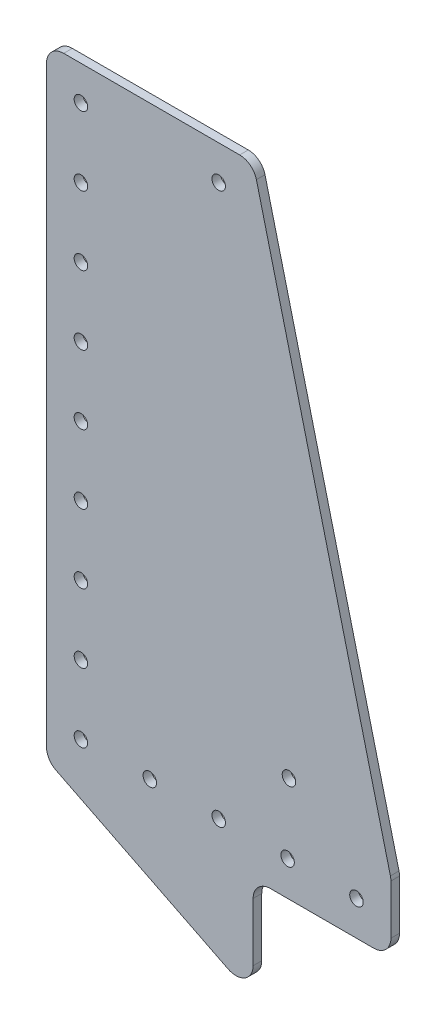
ISO-10303-21;
HEADER;
FILE_DESCRIPTION(('STEP AP214'),'2;1');
FILE_NAME('part.step','',(''),(''),'','','');
FILE_SCHEMA(('AUTOMOTIVE_DESIGN { 1 0 10303 214 1 1 1 1 }'));
ENDSEC;
DATA;
#1=APPLICATION_CONTEXT('core data for automotive mechanical design processes');
#2=APPLICATION_PROTOCOL_DEFINITION('international standard','automotive_design',2000,#1);
#3=PRODUCT_CONTEXT('',#1,'mechanical');
#4=PRODUCT('Part','Part','',(#3));
#5=PRODUCT_RELATED_PRODUCT_CATEGORY('part','',(#4));
#6=PRODUCT_DEFINITION_FORMATION('','',#4);
#7=PRODUCT_DEFINITION_CONTEXT('part definition',#1,'design');
#8=PRODUCT_DEFINITION('design','',#6,#7);
#9=PRODUCT_DEFINITION_SHAPE('','',#8);
#10=(LENGTH_UNIT() NAMED_UNIT(*) SI_UNIT(.MILLI.,.METRE.));
#11=(NAMED_UNIT(*) PLANE_ANGLE_UNIT() SI_UNIT($,.RADIAN.));
#12=(NAMED_UNIT(*) SI_UNIT($,.STERADIAN.) SOLID_ANGLE_UNIT());
#13=UNCERTAINTY_MEASURE_WITH_UNIT(LENGTH_MEASURE(1.E-05),#10,'distance_accuracy_value','');
#14=(GEOMETRIC_REPRESENTATION_CONTEXT(3) GLOBAL_UNCERTAINTY_ASSIGNED_CONTEXT((#13)) GLOBAL_UNIT_ASSIGNED_CONTEXT((#10,
#11,#12)) REPRESENTATION_CONTEXT('',''));
#15=CARTESIAN_POINT('',(0.,0.,0.));
#16=DIRECTION('',(0.,0.,1.));
#17=DIRECTION('',(1.,0.,0.));
#18=AXIS2_PLACEMENT_3D('',#15,#16,#17);
#19=CARTESIAN_POINT('',(133.35,449.423468227803,3.175));
#20=DIRECTION('',(-1.,0.,0.));
#21=DIRECTION('',(0.,0.,1.));
#22=AXIS2_PLACEMENT_3D('',#19,#20,#21);
#23=PLANE('',#22);
#24=DIRECTION('',(0.,1.,0.));
#25=VECTOR('',#24,1.);
#26=CARTESIAN_POINT('',(133.35,449.423468227803,3.175));
#27=LINE('',#26,#25);
#28=CARTESIAN_POINT('',(133.35,455.773468227803,3.175));
#29=VERTEX_POINT('',#28);
#30=CARTESIAN_POINT('',(133.35,474.041747505131,3.175));
#31=VERTEX_POINT('',#30);
#32=EDGE_CURVE('E162',#29,#31,#27,.T.);
#33=ORIENTED_EDGE('',*,*,#32,.F.);
#34=DIRECTION('',(0.,0.,-1.));
#35=VECTOR('',#34,1.);
#36=CARTESIAN_POINT('',(133.35,455.773468227803,3.175));
#37=LINE('',#36,#35);
#38=CARTESIAN_POINT('',(133.35,455.773468227803,0.));
#39=VERTEX_POINT('',#38);
#40=EDGE_CURVE('E147',#29,#39,#37,.T.);
#41=ORIENTED_EDGE('',*,*,#40,.T.);
#42=DIRECTION('',(0.,1.,0.));
#43=VECTOR('',#42,1.);
#44=CARTESIAN_POINT('',(133.35,449.423468227803,0.));
#45=LINE('',#44,#43);
#46=CARTESIAN_POINT('',(133.35,474.041747505131,0.));
#47=VERTEX_POINT('',#46);
#48=EDGE_CURVE('E159',#39,#47,#45,.T.);
#49=ORIENTED_EDGE('',*,*,#48,.T.);
#50=DIRECTION('',(0.,0.,-1.));
#51=VECTOR('',#50,1.);
#52=CARTESIAN_POINT('',(133.35,474.041747505131,3.175));
#53=LINE('',#52,#51);
#54=EDGE_CURVE('E164',#47,#31,#53,.F.);
#55=ORIENTED_EDGE('',*,*,#54,.T.);
#56=EDGE_LOOP('',(#33,#41,#49,#55));
#57=FACE_BOUND('',#56,.T.);
#58=ADVANCED_FACE('F41',(#57),#23,.F.);
#59=CARTESIAN_POINT('',(133.35,474.823468227803,3.175));
#60=DIRECTION('',(-0.970142500145332,-0.242535625036333,0.));
#61=DIRECTION('',(0.242535625036333,-0.970142500145332,0.));
#62=AXIS2_PLACEMENT_3D('',#59,#60,#61);
#63=PLANE('',#62);
#64=DIRECTION('',(-0.242535625036333,0.970142500145332,0.));
#65=VECTOR('',#64,1.);
#66=CARTESIAN_POINT('',(133.35,474.823468227803,0.));
#67=LINE('',#66,#65);
#68=CARTESIAN_POINT('',(133.160404875923,475.581848724112,0.));
#69=VERTEX_POINT('',#68);
#70=CARTESIAN_POINT('',(83.7524746952547,673.213569446784,0.));
#71=VERTEX_POINT('',#70);
#72=EDGE_CURVE('E169',#69,#71,#67,.T.);
#73=ORIENTED_EDGE('',*,*,#72,.T.);
#74=DIRECTION('',(0.,0.,-1.));
#75=VECTOR('',#74,1.);
#76=CARTESIAN_POINT('',(83.7524746952547,673.213569446784,3.175));
#77=LINE('',#76,#75);
#78=CARTESIAN_POINT('',(83.7524746952547,673.213569446784,3.175));
#79=VERTEX_POINT('',#78);
#80=EDGE_CURVE('E238',#71,#79,#77,.F.);
#81=ORIENTED_EDGE('',*,*,#80,.T.);
#82=DIRECTION('',(-0.242535625036333,0.970142500145332,0.));
#83=VECTOR('',#82,1.);
#84=CARTESIAN_POINT('',(133.35,474.823468227803,3.175));
#85=LINE('',#84,#83);
#86=CARTESIAN_POINT('',(133.160404875923,475.581848724112,3.175));
#87=VERTEX_POINT('',#86);
#88=EDGE_CURVE('E261',#87,#79,#85,.T.);
#89=ORIENTED_EDGE('',*,*,#88,.F.);
#90=DIRECTION('',(0.,0.,-1.));
#91=VECTOR('',#90,1.);
#92=CARTESIAN_POINT('',(133.160404875923,475.581848724112,3.175));
#93=LINE('',#92,#91);
#94=EDGE_CURVE('E235',#87,#69,#93,.T.);
#95=ORIENTED_EDGE('',*,*,#94,.T.);
#96=EDGE_LOOP('',(#73,#81,#89,#95));
#97=FACE_BOUND('',#96,.T.);
#98=ADVANCED_FACE('F383',(#97),#63,.F.);
#99=CARTESIAN_POINT('',(6.34999999999988,678.023468227803,3.175));
#100=DIRECTION('',(0.,-1.,0.));
#101=DIRECTION('',(1.,0.,0.));
#102=AXIS2_PLACEMENT_3D('',#99,#100,#101);
#103=PLANE('',#102);
#104=DIRECTION('',(-1.,0.,0.));
#105=VECTOR('',#104,1.);
#106=CARTESIAN_POINT('',(6.34999999999988,678.023468227803,3.175));
#107=LINE('',#106,#105);
#108=CARTESIAN_POINT('',(77.5920698193318,678.023468227803,3.175));
#109=VERTEX_POINT('',#108);
#110=CARTESIAN_POINT('',(12.6999999999999,678.023468227803,3.175));
#111=VERTEX_POINT('',#110);
#112=EDGE_CURVE('E258',#109,#111,#107,.T.);
#113=ORIENTED_EDGE('',*,*,#112,.F.);
#114=DIRECTION('',(0.,0.,-1.));
#115=VECTOR('',#114,1.);
#116=CARTESIAN_POINT('',(77.5920698193318,678.023468227803,3.175));
#117=LINE('',#116,#115);
#118=CARTESIAN_POINT('',(77.5920698193318,678.023468227803,0.));
#119=VERTEX_POINT('',#118);
#120=EDGE_CURVE('E232',#109,#119,#117,.T.);
#121=ORIENTED_EDGE('',*,*,#120,.T.);
#122=DIRECTION('',(-1.,0.,0.));
#123=VECTOR('',#122,1.);
#124=CARTESIAN_POINT('',(6.34999999999988,678.023468227803,0.));
#125=LINE('',#124,#123);
#126=CARTESIAN_POINT('',(12.6999999999999,678.023468227803,0.));
#127=VERTEX_POINT('',#126);
#128=EDGE_CURVE('E173',#119,#127,#125,.T.);
#129=ORIENTED_EDGE('',*,*,#128,.T.);
#130=DIRECTION('',(0.,0.,-1.));
#131=VECTOR('',#130,1.);
#132=CARTESIAN_POINT('',(12.6999999999999,678.023468227803,3.175));
#133=LINE('',#132,#131);
#134=EDGE_CURVE('E230',#127,#111,#133,.F.);
#135=ORIENTED_EDGE('',*,*,#134,.T.);
#136=EDGE_LOOP('',(#113,#121,#129,#135));
#137=FACE_BOUND('',#136,.T.);
#138=ADVANCED_FACE('F389',(#137),#103,.F.);
#139=CARTESIAN_POINT('',(6.34999999999988,678.023468227803,3.175));
#140=DIRECTION('',(1.,0.,0.));
#141=DIRECTION('',(0.,1.,0.));
#142=AXIS2_PLACEMENT_3D('',#139,#140,#141);
#143=PLANE('',#142);
#144=DIRECTION('',(0.,-1.,0.));
#145=VECTOR('',#144,1.);
#146=CARTESIAN_POINT('',(6.34999999999988,678.023468227803,0.));
#147=LINE('',#146,#145);
#148=CARTESIAN_POINT('',(6.34999999999988,671.673468227803,0.));
#149=VERTEX_POINT('',#148);
#150=CARTESIAN_POINT('',(6.34999999999991,453.347984056365,0.));
#151=VERTEX_POINT('',#150);
#152=EDGE_CURVE('E184',#149,#151,#147,.T.);
#153=ORIENTED_EDGE('',*,*,#152,.T.);
#154=DIRECTION('',(0.,0.,-1.));
#155=VECTOR('',#154,1.);
#156=CARTESIAN_POINT('',(6.34999999999991,453.347984056365,3.175));
#157=LINE('',#156,#155);
#158=CARTESIAN_POINT('',(6.34999999999991,453.347984056365,3.175));
#159=VERTEX_POINT('',#158);
#160=EDGE_CURVE('E228',#151,#159,#157,.F.);
#161=ORIENTED_EDGE('',*,*,#160,.T.);
#162=DIRECTION('',(0.,-1.,0.));
#163=VECTOR('',#162,1.);
#164=CARTESIAN_POINT('',(6.34999999999988,678.023468227803,3.175));
#165=LINE('',#164,#163);
#166=CARTESIAN_POINT('',(6.34999999999988,671.673468227803,3.175));
#167=VERTEX_POINT('',#166);
#168=EDGE_CURVE('E253',#167,#159,#165,.T.);
#169=ORIENTED_EDGE('',*,*,#168,.F.);
#170=DIRECTION('',(0.,0.,-1.));
#171=VECTOR('',#170,1.);
#172=CARTESIAN_POINT('',(6.34999999999988,671.673468227803,3.175));
#173=LINE('',#172,#171);
#174=EDGE_CURVE('E225',#167,#149,#173,.T.);
#175=ORIENTED_EDGE('',*,*,#174,.T.);
#176=EDGE_LOOP('',(#153,#161,#169,#175));
#177=FACE_BOUND('',#176,.T.);
#178=ADVANCED_FACE('F432',(#177),#143,.F.);
#179=CARTESIAN_POINT('',(6.34999999999991,449.423468227803,3.175));
#180=DIRECTION('',(0.447213595499958,0.894427190999916,0.));
#181=DIRECTION('',(-0.894427190999916,0.447213595499958,0.));
#182=AXIS2_PLACEMENT_3D('',#179,#180,#181);
#183=PLANE('',#182);
#184=DIRECTION('',(0.894427190999916,-0.447213595499958,0.));
#185=VECTOR('',#184,1.);
#186=CARTESIAN_POINT('',(6.34999999999991,449.423468227803,0.));
#187=LINE('',#186,#185);
#188=CARTESIAN_POINT('',(9.8601936685752,447.668371393515,0.));
#189=VERTEX_POINT('',#188);
#190=CARTESIAN_POINT('',(73.3601936685752,415.918371393515,0.));
#191=VERTEX_POINT('',#190);
#192=EDGE_CURVE('E187',#189,#191,#187,.T.);
#193=ORIENTED_EDGE('',*,*,#192,.T.);
#194=DIRECTION('',(0.,0.,-1.));
#195=VECTOR('',#194,1.);
#196=CARTESIAN_POINT('',(73.3601936685752,415.918371393515,3.175));
#197=LINE('',#196,#195);
#198=CARTESIAN_POINT('',(73.3601936685752,415.918371393515,3.175));
#199=VERTEX_POINT('',#198);
#200=EDGE_CURVE('E223',#191,#199,#197,.F.);
#201=ORIENTED_EDGE('',*,*,#200,.T.);
#202=DIRECTION('',(0.894427190999916,-0.447213595499958,0.));
#203=VECTOR('',#202,1.);
#204=CARTESIAN_POINT('',(6.34999999999991,449.423468227803,3.175));
#205=LINE('',#204,#203);
#206=CARTESIAN_POINT('',(9.8601936685752,447.668371393515,3.175));
#207=VERTEX_POINT('',#206);
#208=EDGE_CURVE('E252',#207,#199,#205,.T.);
#209=ORIENTED_EDGE('',*,*,#208,.F.);
#210=DIRECTION('',(0.,0.,-1.));
#211=VECTOR('',#210,1.);
#212=CARTESIAN_POINT('',(9.8601936685752,447.668371393515,3.175));
#213=LINE('',#212,#211);
#214=EDGE_CURVE('E220',#207,#189,#213,.T.);
#215=ORIENTED_EDGE('',*,*,#214,.T.);
#216=EDGE_LOOP('',(#193,#201,#209,#215));
#217=FACE_BOUND('',#216,.T.);
#218=ADVANCED_FACE('F438',(#217),#183,.F.);
#219=CARTESIAN_POINT('',(82.5499999999999,411.323468227803,3.175));
#220=DIRECTION('',(-1.,0.,0.));
#221=DIRECTION('',(0.,0.,1.));
#222=AXIS2_PLACEMENT_3D('',#219,#220,#221);
#223=PLANE('',#222);
#224=DIRECTION('',(0.,1.,0.));
#225=VECTOR('',#224,1.);
#226=CARTESIAN_POINT('',(82.5499999999999,411.323468227803,0.));
#227=LINE('',#226,#225);
#228=CARTESIAN_POINT('',(82.5499999999999,421.597984056365,0.));
#229=VERTEX_POINT('',#228);
#230=CARTESIAN_POINT('',(82.5499999999999,443.073468227803,0.));
#231=VERTEX_POINT('',#230);
#232=EDGE_CURVE('E190',#229,#231,#227,.T.);
#233=ORIENTED_EDGE('',*,*,#232,.T.);
#234=DIRECTION('',(0.,0.,-1.));
#235=VECTOR('',#234,1.);
#236=CARTESIAN_POINT('',(82.5499999999999,443.073468227803,3.175));
#237=LINE('',#236,#235);
#238=CARTESIAN_POINT('',(82.5499999999999,443.073468227803,3.175));
#239=VERTEX_POINT('',#238);
#240=EDGE_CURVE('E56',#231,#239,#237,.F.);
#241=ORIENTED_EDGE('',*,*,#240,.T.);
#242=DIRECTION('',(0.,1.,0.));
#243=VECTOR('',#242,1.);
#244=CARTESIAN_POINT('',(82.5499999999999,411.323468227803,3.175));
#245=LINE('',#244,#243);
#246=CARTESIAN_POINT('',(82.5499999999999,421.597984056365,3.175));
#247=VERTEX_POINT('',#246);
#248=EDGE_CURVE('E249',#247,#239,#245,.T.);
#249=ORIENTED_EDGE('',*,*,#248,.F.);
#250=DIRECTION('',(0.,0.,-1.));
#251=VECTOR('',#250,1.);
#252=CARTESIAN_POINT('',(82.5499999999999,421.597984056365,3.175));
#253=LINE('',#252,#251);
#254=EDGE_CURVE('E216',#247,#229,#253,.T.);
#255=ORIENTED_EDGE('',*,*,#254,.T.);
#256=EDGE_LOOP('',(#233,#241,#249,#255));
#257=FACE_BOUND('',#256,.T.);
#258=ADVANCED_FACE('F242',(#257),#223,.F.);
#259=CARTESIAN_POINT('',(133.35,449.423468227803,3.175));
#260=DIRECTION('',(0.,1.,0.));
#261=DIRECTION('',(0.,0.,1.));
#262=AXIS2_PLACEMENT_3D('',#259,#260,#261);
#263=PLANE('',#262);
#264=DIRECTION('',(1.,0.,0.));
#265=VECTOR('',#264,1.);
#266=CARTESIAN_POINT('',(133.35,449.423468227803,0.));
#267=LINE('',#266,#265);
#268=CARTESIAN_POINT('',(88.8999999999999,449.423468227803,0.));
#269=VERTEX_POINT('',#268);
#270=CARTESIAN_POINT('',(127.,449.423468227803,0.));
#271=VERTEX_POINT('',#270);
#272=EDGE_CURVE('E192',#269,#271,#267,.T.);
#273=ORIENTED_EDGE('',*,*,#272,.T.);
#274=DIRECTION('',(0.,0.,-1.));
#275=VECTOR('',#274,1.);
#276=CARTESIAN_POINT('',(127.,449.423468227803,3.175));
#277=LINE('',#276,#275);
#278=CARTESIAN_POINT('',(127.,449.423468227803,3.175));
#279=VERTEX_POINT('',#278);
#280=EDGE_CURVE('E148',#271,#279,#277,.F.);
#281=ORIENTED_EDGE('',*,*,#280,.T.);
#282=DIRECTION('',(1.,0.,0.));
#283=VECTOR('',#282,1.);
#284=CARTESIAN_POINT('',(133.35,449.423468227803,3.175));
#285=LINE('',#284,#283);
#286=CARTESIAN_POINT('',(88.8999999999999,449.423468227803,3.175));
#287=VERTEX_POINT('',#286);
#288=EDGE_CURVE('E179',#287,#279,#285,.T.);
#289=ORIENTED_EDGE('',*,*,#288,.F.);
#290=DIRECTION('',(0.,0.,-1.));
#291=VECTOR('',#290,1.);
#292=CARTESIAN_POINT('',(88.8999999999999,449.423468227803,0.));
#293=LINE('',#292,#291);
#294=EDGE_CURVE('E153',#287,#269,#293,.T.);
#295=ORIENTED_EDGE('',*,*,#294,.T.);
#296=EDGE_LOOP('',(#273,#281,#289,#295));
#297=FACE_BOUND('',#296,.T.);
#298=ADVANCED_FACE('F251',(#297),#263,.F.);
#299=CARTESIAN_POINT('',(0.,0.,3.175));
#300=DIRECTION('',(0.,0.,-1.));
#301=DIRECTION('',(-1.,0.,0.));
#302=AXIS2_PLACEMENT_3D('',#299,#300,#301);
#303=PLANE('',#302);
#304=CARTESIAN_POINT('',(69.8500000000001,665.323468227803,3.175));
#305=DIRECTION('',(0.,0.,1.));
#306=DIRECTION('',(1.,0.,0.));
#307=AXIS2_PLACEMENT_3D('',#304,#305,#306);
#308=CIRCLE('',#307,2.48919999999991);
#309=CARTESIAN_POINT('',(72.3392,665.323468227803,3.175));
#310=VERTEX_POINT('',#309);
#311=EDGE_CURVE('E271',#310,#310,#308,.T.);
#312=ORIENTED_EDGE('',*,*,#311,.F.);
#313=EDGE_LOOP('',(#312));
#314=FACE_BOUND('',#313,.T.);
#315=CARTESIAN_POINT('',(19.0500000000001,665.323468227803,3.175));
#316=DIRECTION('',(0.,0.,1.));
#317=DIRECTION('',(1.,0.,0.));
#318=AXIS2_PLACEMENT_3D('',#315,#316,#317);
#319=CIRCLE('',#318,2.48919999999992);
#320=CARTESIAN_POINT('',(21.5392,665.323468227803,3.175));
#321=VERTEX_POINT('',#320);
#322=EDGE_CURVE('E277',#321,#321,#319,.T.);
#323=ORIENTED_EDGE('',*,*,#322,.F.);
#324=EDGE_LOOP('',(#323));
#325=FACE_BOUND('',#324,.T.);
#326=CARTESIAN_POINT('',(19.0500000000001,639.923468227803,3.175));
#327=DIRECTION('',(0.,0.,1.));
#328=DIRECTION('',(1.,0.,0.));
#329=AXIS2_PLACEMENT_3D('',#326,#327,#328);
#330=CIRCLE('',#329,2.48919999999989);
#331=CARTESIAN_POINT('',(21.5392,639.923468227803,3.175));
#332=VERTEX_POINT('',#331);
#333=EDGE_CURVE('E283',#332,#332,#330,.T.);
#334=ORIENTED_EDGE('',*,*,#333,.F.);
#335=EDGE_LOOP('',(#334));
#336=FACE_BOUND('',#335,.T.);
#337=CARTESIAN_POINT('',(19.0500000000001,614.523468227803,3.175));
#338=DIRECTION('',(0.,0.,1.));
#339=DIRECTION('',(1.,0.,0.));
#340=AXIS2_PLACEMENT_3D('',#337,#338,#339);
#341=CIRCLE('',#340,2.48919999999988);
#342=CARTESIAN_POINT('',(21.5391999999999,614.523468227803,3.175));
#343=VERTEX_POINT('',#342);
#344=EDGE_CURVE('E289',#343,#343,#341,.T.);
#345=ORIENTED_EDGE('',*,*,#344,.F.);
#346=EDGE_LOOP('',(#345));
#347=FACE_BOUND('',#346,.T.);
#348=CARTESIAN_POINT('',(19.0500000000001,589.123468227803,3.175));
#349=DIRECTION('',(0.,0.,1.));
#350=DIRECTION('',(1.,0.,0.));
#351=AXIS2_PLACEMENT_3D('',#348,#349,#350);
#352=CIRCLE('',#351,2.48919999999992);
#353=CARTESIAN_POINT('',(21.5392,589.123468227803,3.175));
#354=VERTEX_POINT('',#353);
#355=EDGE_CURVE('E295',#354,#354,#352,.T.);
#356=ORIENTED_EDGE('',*,*,#355,.F.);
#357=EDGE_LOOP('',(#356));
#358=FACE_BOUND('',#357,.T.);
#359=CARTESIAN_POINT('',(19.0500000000001,563.723468227803,3.175));
#360=DIRECTION('',(0.,0.,1.));
#361=DIRECTION('',(1.,0.,0.));
#362=AXIS2_PLACEMENT_3D('',#359,#360,#361);
#363=CIRCLE('',#362,2.48919999999989);
#364=CARTESIAN_POINT('',(21.5392,563.723468227803,3.175));
#365=VERTEX_POINT('',#364);
#366=EDGE_CURVE('E301',#365,#365,#363,.T.);
#367=ORIENTED_EDGE('',*,*,#366,.F.);
#368=EDGE_LOOP('',(#367));
#369=FACE_BOUND('',#368,.T.);
#370=CARTESIAN_POINT('',(95.2500000000001,462.123468227803,3.175));
#371=DIRECTION('',(0.,0.,1.));
#372=DIRECTION('',(1.,0.,0.));
#373=AXIS2_PLACEMENT_3D('',#370,#371,#372);
#374=CIRCLE('',#373,2.48920000000002);
#375=CARTESIAN_POINT('',(97.7392000000001,462.123468227803,3.175));
#376=VERTEX_POINT('',#375);
#377=EDGE_CURVE('E320',#376,#376,#374,.T.);
#378=ORIENTED_EDGE('',*,*,#377,.F.);
#379=EDGE_LOOP('',(#378));
#380=FACE_BOUND('',#379,.T.);
#381=CARTESIAN_POINT('',(69.8500000000001,462.123468227803,3.175));
#382=DIRECTION('',(0.,0.,1.));
#383=DIRECTION('',(1.,0.,0.));
#384=AXIS2_PLACEMENT_3D('',#381,#382,#383);
#385=CIRCLE('',#384,2.48920000000002);
#386=CARTESIAN_POINT('',(72.3392000000001,462.123468227803,3.175));
#387=VERTEX_POINT('',#386);
#388=EDGE_CURVE('E309',#387,#387,#385,.T.);
#389=ORIENTED_EDGE('',*,*,#388,.F.);
#390=EDGE_LOOP('',(#389));
#391=FACE_BOUND('',#390,.T.);
#392=CARTESIAN_POINT('',(44.4500000000001,462.123468227803,3.175));
#393=DIRECTION('',(0.,0.,1.));
#394=DIRECTION('',(1.,0.,0.));
#395=AXIS2_PLACEMENT_3D('',#392,#393,#394);
#396=CIRCLE('',#395,2.48919999999999);
#397=CARTESIAN_POINT('',(46.9392000000001,462.123468227803,3.175));
#398=VERTEX_POINT('',#397);
#399=EDGE_CURVE('E308',#398,#398,#396,.T.);
#400=ORIENTED_EDGE('',*,*,#399,.F.);
#401=EDGE_LOOP('',(#400));
#402=FACE_BOUND('',#401,.T.);
#403=CARTESIAN_POINT('',(95.7579999999999,488.031468227803,3.175));
#404=DIRECTION('',(0.,0.,1.));
#405=DIRECTION('',(1.,0.,0.));
#406=AXIS2_PLACEMENT_3D('',#403,#404,#405);
#407=CIRCLE('',#406,2.48919999999999);
#408=CARTESIAN_POINT('',(98.2471999999999,488.031468227803,3.175));
#409=VERTEX_POINT('',#408);
#410=EDGE_CURVE('E266',#409,#409,#407,.T.);
#411=ORIENTED_EDGE('',*,*,#410,.F.);
#412=EDGE_LOOP('',(#411));
#413=FACE_BOUND('',#412,.T.);
#414=CARTESIAN_POINT('',(120.65,462.123468227803,3.175));
#415=DIRECTION('',(0.,0.,1.));
#416=DIRECTION('',(1.,0.,0.));
#417=AXIS2_PLACEMENT_3D('',#414,#415,#416);
#418=CIRCLE('',#417,2.48920000000003);
#419=CARTESIAN_POINT('',(123.1392,462.123468227803,3.175));
#420=VERTEX_POINT('',#419);
#421=EDGE_CURVE('E321',#420,#420,#418,.T.);
#422=ORIENTED_EDGE('',*,*,#421,.F.);
#423=EDGE_LOOP('',(#422));
#424=FACE_BOUND('',#423,.T.);
#425=CARTESIAN_POINT('',(19.0500000000001,487.523468227803,3.175));
#426=DIRECTION('',(0.,0.,1.));
#427=DIRECTION('',(1.,0.,0.));
#428=AXIS2_PLACEMENT_3D('',#425,#426,#427);
#429=CIRCLE('',#428,2.48919999999992);
#430=CARTESIAN_POINT('',(21.5392,487.523468227803,3.175));
#431=VERTEX_POINT('',#430);
#432=EDGE_CURVE('E343',#431,#431,#429,.T.);
#433=ORIENTED_EDGE('',*,*,#432,.F.);
#434=EDGE_LOOP('',(#433));
#435=FACE_BOUND('',#434,.T.);
#436=CARTESIAN_POINT('',(19.0500000000001,512.923468227803,3.175));
#437=DIRECTION('',(0.,0.,1.));
#438=DIRECTION('',(1.,0.,0.));
#439=AXIS2_PLACEMENT_3D('',#436,#437,#438);
#440=CIRCLE('',#439,2.48919999999989);
#441=CARTESIAN_POINT('',(21.5392,512.923468227803,3.175));
#442=VERTEX_POINT('',#441);
#443=EDGE_CURVE('E337',#442,#442,#440,.T.);
#444=ORIENTED_EDGE('',*,*,#443,.F.);
#445=EDGE_LOOP('',(#444));
#446=FACE_BOUND('',#445,.T.);
#447=CARTESIAN_POINT('',(19.0500000000001,538.323468227803,3.175));
#448=DIRECTION('',(0.,0.,1.));
#449=DIRECTION('',(1.,0.,0.));
#450=AXIS2_PLACEMENT_3D('',#447,#448,#449);
#451=CIRCLE('',#450,2.48919999999992);
#452=CARTESIAN_POINT('',(21.5392,538.323468227803,3.175));
#453=VERTEX_POINT('',#452);
#454=EDGE_CURVE('E331',#453,#453,#451,.T.);
#455=ORIENTED_EDGE('',*,*,#454,.F.);
#456=EDGE_LOOP('',(#455));
#457=FACE_BOUND('',#456,.T.);
#458=CARTESIAN_POINT('',(19.0500000000001,462.123468227803,3.175));
#459=DIRECTION('',(0.,0.,1.));
#460=DIRECTION('',(1.,0.,0.));
#461=AXIS2_PLACEMENT_3D('',#458,#459,#460);
#462=CIRCLE('',#461,2.4892);
#463=CARTESIAN_POINT('',(21.5392000000001,462.123468227803,3.175));
#464=VERTEX_POINT('',#463);
#465=EDGE_CURVE('E176',#464,#464,#462,.T.);
#466=ORIENTED_EDGE('',*,*,#465,.F.);
#467=EDGE_LOOP('',(#466));
#468=FACE_BOUND('',#467,.T.);
#469=ORIENTED_EDGE('',*,*,#288,.T.);
#470=CARTESIAN_POINT('',(127.,455.773468227803,3.175));
#471=DIRECTION('',(0.,0.,-1.));
#472=DIRECTION('',(-1.,0.,0.));
#473=AXIS2_PLACEMENT_3D('',#470,#471,#472);
#474=CIRCLE('',#473,6.35);
#475=EDGE_CURVE('E214',#279,#29,#474,.F.);
#476=ORIENTED_EDGE('',*,*,#475,.T.);
#477=ORIENTED_EDGE('',*,*,#32,.T.);
#478=CARTESIAN_POINT('',(127.,474.041747505131,3.175));
#479=DIRECTION('',(0.,0.,-1.));
#480=DIRECTION('',(-1.,0.,0.));
#481=AXIS2_PLACEMENT_3D('',#478,#479,#480);
#482=CIRCLE('',#481,6.35);
#483=EDGE_CURVE('E207',#31,#87,#482,.F.);
#484=ORIENTED_EDGE('',*,*,#483,.T.);
#485=ORIENTED_EDGE('',*,*,#88,.T.);
#486=CARTESIAN_POINT('',(77.5920698193318,671.673468227803,3.175));
#487=DIRECTION('',(0.,0.,-1.));
#488=DIRECTION('',(-1.,0.,0.));
#489=AXIS2_PLACEMENT_3D('',#486,#487,#488);
#490=CIRCLE('',#489,6.35);
#491=EDGE_CURVE('E209',#79,#109,#490,.F.);
#492=ORIENTED_EDGE('',*,*,#491,.T.);
#493=ORIENTED_EDGE('',*,*,#112,.T.);
#494=CARTESIAN_POINT('',(12.6999999999999,671.673468227803,3.175));
#495=DIRECTION('',(0.,0.,-1.));
#496=DIRECTION('',(-1.,0.,0.));
#497=AXIS2_PLACEMENT_3D('',#494,#495,#496);
#498=CIRCLE('',#497,6.35);
#499=EDGE_CURVE('E205',#111,#167,#498,.F.);
#500=ORIENTED_EDGE('',*,*,#499,.T.);
#501=ORIENTED_EDGE('',*,*,#168,.T.);
#502=CARTESIAN_POINT('',(12.6999999999999,453.347984056365,3.175));
#503=DIRECTION('',(0.,0.,-1.));
#504=DIRECTION('',(-1.,0.,0.));
#505=AXIS2_PLACEMENT_3D('',#502,#503,#504);
#506=CIRCLE('',#505,6.35);
#507=EDGE_CURVE('E211',#159,#207,#506,.F.);
#508=ORIENTED_EDGE('',*,*,#507,.T.);
#509=ORIENTED_EDGE('',*,*,#208,.T.);
#510=CARTESIAN_POINT('',(76.1999999999999,421.597984056365,3.175));
#511=DIRECTION('',(0.,0.,-1.));
#512=DIRECTION('',(-1.,0.,0.));
#513=AXIS2_PLACEMENT_3D('',#510,#511,#512);
#514=CIRCLE('',#513,6.35);
#515=EDGE_CURVE('E63',#199,#247,#514,.F.);
#516=ORIENTED_EDGE('',*,*,#515,.T.);
#517=ORIENTED_EDGE('',*,*,#248,.T.);
#518=CARTESIAN_POINT('',(88.8999999999999,443.073468227803,3.175));
#519=DIRECTION('',(0.,0.,-1.));
#520=DIRECTION('',(-1.,0.,0.));
#521=AXIS2_PLACEMENT_3D('',#518,#519,#520);
#522=CIRCLE('',#521,6.35);
#523=EDGE_CURVE('E11',#239,#287,#522,.T.);
#524=ORIENTED_EDGE('',*,*,#523,.T.);
#525=EDGE_LOOP('',(#469,#476,#477,#484,#485,#492,#493,#500,#501,#508,#509,#516,#517,#524));
#526=FACE_BOUND('',#525,.T.);
#527=ADVANCED_FACE('F248',(#314,#325,#336,#347,#358,#369,#380,#391,#402,#413,#424,#435,#446,
#457,#468,#526),#303,.F.);
#528=CARTESIAN_POINT('',(0.,0.,0.));
#529=DIRECTION('',(0.,0.,-1.));
#530=DIRECTION('',(-1.,0.,0.));
#531=AXIS2_PLACEMENT_3D('',#528,#529,#530);
#532=PLANE('',#531);
#533=CARTESIAN_POINT('',(69.8500000000001,665.323468227803,0.));
#534=DIRECTION('',(0.,0.,1.));
#535=DIRECTION('',(1.,0.,0.));
#536=AXIS2_PLACEMENT_3D('',#533,#534,#535);
#537=CIRCLE('',#536,2.48919999999991);
#538=CARTESIAN_POINT('',(72.3392,665.323468227803,0.));
#539=VERTEX_POINT('',#538);
#540=EDGE_CURVE('E268',#539,#539,#537,.T.);
#541=ORIENTED_EDGE('',*,*,#540,.T.);
#542=EDGE_LOOP('',(#541));
#543=FACE_BOUND('',#542,.T.);
#544=CARTESIAN_POINT('',(19.0500000000001,665.323468227803,0.));
#545=DIRECTION('',(0.,0.,1.));
#546=DIRECTION('',(1.,0.,0.));
#547=AXIS2_PLACEMENT_3D('',#544,#545,#546);
#548=CIRCLE('',#547,2.48919999999992);
#549=CARTESIAN_POINT('',(21.5392,665.323468227803,0.));
#550=VERTEX_POINT('',#549);
#551=EDGE_CURVE('E274',#550,#550,#548,.T.);
#552=ORIENTED_EDGE('',*,*,#551,.T.);
#553=EDGE_LOOP('',(#552));
#554=FACE_BOUND('',#553,.T.);
#555=CARTESIAN_POINT('',(19.0500000000001,639.923468227803,0.));
#556=DIRECTION('',(0.,0.,1.));
#557=DIRECTION('',(1.,0.,0.));
#558=AXIS2_PLACEMENT_3D('',#555,#556,#557);
#559=CIRCLE('',#558,2.48919999999989);
#560=CARTESIAN_POINT('',(21.5392,639.923468227803,0.));
#561=VERTEX_POINT('',#560);
#562=EDGE_CURVE('E280',#561,#561,#559,.T.);
#563=ORIENTED_EDGE('',*,*,#562,.T.);
#564=EDGE_LOOP('',(#563));
#565=FACE_BOUND('',#564,.T.);
#566=CARTESIAN_POINT('',(19.0500000000001,614.523468227803,0.));
#567=DIRECTION('',(0.,0.,1.));
#568=DIRECTION('',(1.,0.,0.));
#569=AXIS2_PLACEMENT_3D('',#566,#567,#568);
#570=CIRCLE('',#569,2.48919999999988);
#571=CARTESIAN_POINT('',(21.5391999999999,614.523468227803,0.));
#572=VERTEX_POINT('',#571);
#573=EDGE_CURVE('E286',#572,#572,#570,.T.);
#574=ORIENTED_EDGE('',*,*,#573,.T.);
#575=EDGE_LOOP('',(#574));
#576=FACE_BOUND('',#575,.T.);
#577=CARTESIAN_POINT('',(19.0500000000001,589.123468227803,0.));
#578=DIRECTION('',(0.,0.,1.));
#579=DIRECTION('',(1.,0.,0.));
#580=AXIS2_PLACEMENT_3D('',#577,#578,#579);
#581=CIRCLE('',#580,2.48919999999992);
#582=CARTESIAN_POINT('',(21.5392,589.123468227803,0.));
#583=VERTEX_POINT('',#582);
#584=EDGE_CURVE('E292',#583,#583,#581,.T.);
#585=ORIENTED_EDGE('',*,*,#584,.T.);
#586=EDGE_LOOP('',(#585));
#587=FACE_BOUND('',#586,.T.);
#588=CARTESIAN_POINT('',(19.0500000000001,563.723468227803,0.));
#589=DIRECTION('',(0.,0.,1.));
#590=DIRECTION('',(1.,0.,0.));
#591=AXIS2_PLACEMENT_3D('',#588,#589,#590);
#592=CIRCLE('',#591,2.48919999999989);
#593=CARTESIAN_POINT('',(21.5392,563.723468227803,0.));
#594=VERTEX_POINT('',#593);
#595=EDGE_CURVE('E298',#594,#594,#592,.T.);
#596=ORIENTED_EDGE('',*,*,#595,.T.);
#597=EDGE_LOOP('',(#596));
#598=FACE_BOUND('',#597,.T.);
#599=CARTESIAN_POINT('',(95.2500000000001,462.123468227803,0.));
#600=DIRECTION('',(0.,0.,1.));
#601=DIRECTION('',(1.,0.,0.));
#602=AXIS2_PLACEMENT_3D('',#599,#600,#601);
#603=CIRCLE('',#602,2.48920000000002);
#604=CARTESIAN_POINT('',(97.7392000000001,462.123468227803,0.));
#605=VERTEX_POINT('',#604);
#606=EDGE_CURVE('E317',#605,#605,#603,.T.);
#607=ORIENTED_EDGE('',*,*,#606,.T.);
#608=EDGE_LOOP('',(#607));
#609=FACE_BOUND('',#608,.T.);
#610=CARTESIAN_POINT('',(69.8500000000001,462.123468227803,0.));
#611=DIRECTION('',(0.,0.,1.));
#612=DIRECTION('',(1.,0.,0.));
#613=AXIS2_PLACEMENT_3D('',#610,#611,#612);
#614=CIRCLE('',#613,2.48920000000002);
#615=CARTESIAN_POINT('',(72.3392000000001,462.123468227803,0.));
#616=VERTEX_POINT('',#615);
#617=EDGE_CURVE('E324',#616,#616,#614,.T.);
#618=ORIENTED_EDGE('',*,*,#617,.T.);
#619=EDGE_LOOP('',(#618));
#620=FACE_BOUND('',#619,.T.);
#621=CARTESIAN_POINT('',(44.4500000000001,462.123468227803,0.));
#622=DIRECTION('',(0.,0.,1.));
#623=DIRECTION('',(1.,0.,0.));
#624=AXIS2_PLACEMENT_3D('',#621,#622,#623);
#625=CIRCLE('',#624,2.48919999999999);
#626=CARTESIAN_POINT('',(46.9392000000001,462.123468227803,0.));
#627=VERTEX_POINT('',#626);
#628=EDGE_CURVE('E305',#627,#627,#625,.T.);
#629=ORIENTED_EDGE('',*,*,#628,.T.);
#630=EDGE_LOOP('',(#629));
#631=FACE_BOUND('',#630,.T.);
#632=CARTESIAN_POINT('',(95.7579999999999,488.031468227803,0.));
#633=DIRECTION('',(0.,0.,1.));
#634=DIRECTION('',(1.,0.,0.));
#635=AXIS2_PLACEMENT_3D('',#632,#633,#634);
#636=CIRCLE('',#635,2.48919999999999);
#637=CARTESIAN_POINT('',(98.2471999999999,488.031468227803,0.));
#638=VERTEX_POINT('',#637);
#639=EDGE_CURVE('E312',#638,#638,#636,.T.);
#640=ORIENTED_EDGE('',*,*,#639,.T.);
#641=EDGE_LOOP('',(#640));
#642=FACE_BOUND('',#641,.T.);
#643=CARTESIAN_POINT('',(120.65,462.123468227803,0.));
#644=DIRECTION('',(0.,0.,1.));
#645=DIRECTION('',(1.,0.,0.));
#646=AXIS2_PLACEMENT_3D('',#643,#644,#645);
#647=CIRCLE('',#646,2.48920000000003);
#648=CARTESIAN_POINT('',(123.1392,462.123468227803,0.));
#649=VERTEX_POINT('',#648);
#650=EDGE_CURVE('E346',#649,#649,#647,.T.);
#651=ORIENTED_EDGE('',*,*,#650,.T.);
#652=EDGE_LOOP('',(#651));
#653=FACE_BOUND('',#652,.T.);
#654=CARTESIAN_POINT('',(19.0500000000001,487.523468227803,0.));
#655=DIRECTION('',(0.,0.,1.));
#656=DIRECTION('',(1.,0.,0.));
#657=AXIS2_PLACEMENT_3D('',#654,#655,#656);
#658=CIRCLE('',#657,2.48919999999992);
#659=CARTESIAN_POINT('',(21.5392,487.523468227803,0.));
#660=VERTEX_POINT('',#659);
#661=EDGE_CURVE('E340',#660,#660,#658,.T.);
#662=ORIENTED_EDGE('',*,*,#661,.T.);
#663=EDGE_LOOP('',(#662));
#664=FACE_BOUND('',#663,.T.);
#665=CARTESIAN_POINT('',(19.0500000000001,512.923468227803,0.));
#666=DIRECTION('',(0.,0.,1.));
#667=DIRECTION('',(1.,0.,0.));
#668=AXIS2_PLACEMENT_3D('',#665,#666,#667);
#669=CIRCLE('',#668,2.48919999999989);
#670=CARTESIAN_POINT('',(21.5392,512.923468227803,0.));
#671=VERTEX_POINT('',#670);
#672=EDGE_CURVE('E334',#671,#671,#669,.T.);
#673=ORIENTED_EDGE('',*,*,#672,.T.);
#674=EDGE_LOOP('',(#673));
#675=FACE_BOUND('',#674,.T.);
#676=CARTESIAN_POINT('',(19.0500000000001,538.323468227803,0.));
#677=DIRECTION('',(0.,0.,1.));
#678=DIRECTION('',(1.,0.,0.));
#679=AXIS2_PLACEMENT_3D('',#676,#677,#678);
#680=CIRCLE('',#679,2.48919999999992);
#681=CARTESIAN_POINT('',(21.5392,538.323468227803,0.));
#682=VERTEX_POINT('',#681);
#683=EDGE_CURVE('E304',#682,#682,#680,.T.);
#684=ORIENTED_EDGE('',*,*,#683,.T.);
#685=EDGE_LOOP('',(#684));
#686=FACE_BOUND('',#685,.T.);
#687=CARTESIAN_POINT('',(19.0500000000001,462.123468227803,0.));
#688=DIRECTION('',(0.,0.,1.));
#689=DIRECTION('',(1.,0.,0.));
#690=AXIS2_PLACEMENT_3D('',#687,#688,#689);
#691=CIRCLE('',#690,2.4892);
#692=CARTESIAN_POINT('',(21.5392000000001,462.123468227803,0.));
#693=VERTEX_POINT('',#692);
#694=EDGE_CURVE('E170',#693,#693,#691,.T.);
#695=ORIENTED_EDGE('',*,*,#694,.T.);
#696=EDGE_LOOP('',(#695));
#697=FACE_BOUND('',#696,.T.);
#698=ORIENTED_EDGE('',*,*,#48,.F.);
#699=CARTESIAN_POINT('',(127.,455.773468227803,0.));
#700=DIRECTION('',(0.,0.,-1.));
#701=DIRECTION('',(-1.,0.,0.));
#702=AXIS2_PLACEMENT_3D('',#699,#700,#701);
#703=CIRCLE('',#702,6.35);
#704=EDGE_CURVE('E143',#39,#271,#703,.T.);
#705=ORIENTED_EDGE('',*,*,#704,.T.);
#706=ORIENTED_EDGE('',*,*,#272,.F.);
#707=CARTESIAN_POINT('',(88.8999999999999,443.073468227803,0.));
#708=DIRECTION('',(0.,0.,-1.));
#709=DIRECTION('',(-1.,0.,0.));
#710=AXIS2_PLACEMENT_3D('',#707,#708,#709);
#711=CIRCLE('',#710,6.35);
#712=EDGE_CURVE('E49',#269,#231,#711,.F.);
#713=ORIENTED_EDGE('',*,*,#712,.T.);
#714=ORIENTED_EDGE('',*,*,#232,.F.);
#715=CARTESIAN_POINT('',(76.1999999999999,421.597984056365,0.));
#716=DIRECTION('',(0.,0.,-1.));
#717=DIRECTION('',(-1.,0.,0.));
#718=AXIS2_PLACEMENT_3D('',#715,#716,#717);
#719=CIRCLE('',#718,6.35);
#720=EDGE_CURVE('E154',#229,#191,#719,.T.);
#721=ORIENTED_EDGE('',*,*,#720,.T.);
#722=ORIENTED_EDGE('',*,*,#192,.F.);
#723=CARTESIAN_POINT('',(12.6999999999999,453.347984056365,0.));
#724=DIRECTION('',(0.,0.,-1.));
#725=DIRECTION('',(-1.,0.,0.));
#726=AXIS2_PLACEMENT_3D('',#723,#724,#725);
#727=CIRCLE('',#726,6.35);
#728=EDGE_CURVE('E199',#189,#151,#727,.T.);
#729=ORIENTED_EDGE('',*,*,#728,.T.);
#730=ORIENTED_EDGE('',*,*,#152,.F.);
#731=CARTESIAN_POINT('',(12.6999999999999,671.673468227803,0.));
#732=DIRECTION('',(0.,0.,-1.));
#733=DIRECTION('',(-1.,0.,0.));
#734=AXIS2_PLACEMENT_3D('',#731,#732,#733);
#735=CIRCLE('',#734,6.35);
#736=EDGE_CURVE('E163',#149,#127,#735,.T.);
#737=ORIENTED_EDGE('',*,*,#736,.T.);
#738=ORIENTED_EDGE('',*,*,#128,.F.);
#739=CARTESIAN_POINT('',(77.5920698193318,671.673468227803,0.));
#740=DIRECTION('',(0.,0.,-1.));
#741=DIRECTION('',(-1.,0.,0.));
#742=AXIS2_PLACEMENT_3D('',#739,#740,#741);
#743=CIRCLE('',#742,6.35);
#744=EDGE_CURVE('E197',#119,#71,#743,.T.);
#745=ORIENTED_EDGE('',*,*,#744,.T.);
#746=ORIENTED_EDGE('',*,*,#72,.F.);
#747=CARTESIAN_POINT('',(127.,474.041747505131,0.));
#748=DIRECTION('',(0.,0.,-1.));
#749=DIRECTION('',(-1.,0.,0.));
#750=AXIS2_PLACEMENT_3D('',#747,#748,#749);
#751=CIRCLE('',#750,6.35);
#752=EDGE_CURVE('E168',#69,#47,#751,.T.);
#753=ORIENTED_EDGE('',*,*,#752,.T.);
#754=EDGE_LOOP('',(#698,#705,#706,#713,#714,#721,#722,#729,#730,#737,#738,#745,#746,#753));
#755=FACE_BOUND('',#754,.T.);
#756=ADVANCED_FACE('F166',(#543,#554,#565,#576,#587,#598,#609,#620,#631,#642,#653,#664,#675,
#686,#697,#755),#532,.T.);
#757=CARTESIAN_POINT('',(19.0500000000001,462.123468227803,0.));
#758=DIRECTION('',(0.,0.,1.));
#759=DIRECTION('',(1.,0.,0.));
#760=AXIS2_PLACEMENT_3D('',#757,#758,#759);
#761=CYLINDRICAL_SURFACE('',#760,2.4892);
#762=ORIENTED_EDGE('',*,*,#694,.F.);
#763=EDGE_LOOP('',(#762));
#764=FACE_BOUND('',#763,.T.);
#765=ORIENTED_EDGE('',*,*,#465,.T.);
#766=EDGE_LOOP('',(#765));
#767=FACE_BOUND('',#766,.T.);
#768=ADVANCED_FACE('F366',(#764,#767),#761,.F.);
#769=CARTESIAN_POINT('',(19.0500000000001,538.323468227803,0.));
#770=DIRECTION('',(0.,0.,1.));
#771=DIRECTION('',(1.,0.,0.));
#772=AXIS2_PLACEMENT_3D('',#769,#770,#771);
#773=CYLINDRICAL_SURFACE('',#772,2.48919999999992);
#774=ORIENTED_EDGE('',*,*,#683,.F.);
#775=EDGE_LOOP('',(#774));
#776=FACE_BOUND('',#775,.T.);
#777=ORIENTED_EDGE('',*,*,#454,.T.);
#778=EDGE_LOOP('',(#777));
#779=FACE_BOUND('',#778,.T.);
#780=ADVANCED_FACE('F368',(#776,#779),#773,.F.);
#781=CARTESIAN_POINT('',(19.0500000000001,512.923468227803,0.));
#782=DIRECTION('',(0.,0.,1.));
#783=DIRECTION('',(1.,0.,0.));
#784=AXIS2_PLACEMENT_3D('',#781,#782,#783);
#785=CYLINDRICAL_SURFACE('',#784,2.48919999999989);
#786=ORIENTED_EDGE('',*,*,#672,.F.);
#787=EDGE_LOOP('',(#786));
#788=FACE_BOUND('',#787,.T.);
#789=ORIENTED_EDGE('',*,*,#443,.T.);
#790=EDGE_LOOP('',(#789));
#791=FACE_BOUND('',#790,.T.);
#792=ADVANCED_FACE('F374',(#788,#791),#785,.F.);
#793=CARTESIAN_POINT('',(19.0500000000001,487.523468227803,0.));
#794=DIRECTION('',(0.,0.,1.));
#795=DIRECTION('',(1.,0.,0.));
#796=AXIS2_PLACEMENT_3D('',#793,#794,#795);
#797=CYLINDRICAL_SURFACE('',#796,2.48919999999992);
#798=ORIENTED_EDGE('',*,*,#661,.F.);
#799=EDGE_LOOP('',(#798));
#800=FACE_BOUND('',#799,.T.);
#801=ORIENTED_EDGE('',*,*,#432,.T.);
#802=EDGE_LOOP('',(#801));
#803=FACE_BOUND('',#802,.T.);
#804=ADVANCED_FACE('F509',(#800,#803),#797,.F.);
#805=CARTESIAN_POINT('',(120.65,462.123468227803,0.));
#806=DIRECTION('',(0.,0.,1.));
#807=DIRECTION('',(1.,0.,0.));
#808=AXIS2_PLACEMENT_3D('',#805,#806,#807);
#809=CYLINDRICAL_SURFACE('',#808,2.48920000000003);
#810=ORIENTED_EDGE('',*,*,#650,.F.);
#811=EDGE_LOOP('',(#810));
#812=FACE_BOUND('',#811,.T.);
#813=ORIENTED_EDGE('',*,*,#421,.T.);
#814=EDGE_LOOP('',(#813));
#815=FACE_BOUND('',#814,.T.);
#816=ADVANCED_FACE('F352',(#812,#815),#809,.F.);
#817=CARTESIAN_POINT('',(95.7579999999999,488.031468227803,0.));
#818=DIRECTION('',(0.,0.,1.));
#819=DIRECTION('',(1.,0.,0.));
#820=AXIS2_PLACEMENT_3D('',#817,#818,#819);
#821=CYLINDRICAL_SURFACE('',#820,2.48919999999999);
#822=ORIENTED_EDGE('',*,*,#639,.F.);
#823=EDGE_LOOP('',(#822));
#824=FACE_BOUND('',#823,.T.);
#825=ORIENTED_EDGE('',*,*,#410,.T.);
#826=EDGE_LOOP('',(#825));
#827=FACE_BOUND('',#826,.T.);
#828=ADVANCED_FACE('F528',(#824,#827),#821,.F.);
#829=CARTESIAN_POINT('',(44.4500000000001,462.123468227803,0.));
#830=DIRECTION('',(0.,0.,1.));
#831=DIRECTION('',(1.,0.,0.));
#832=AXIS2_PLACEMENT_3D('',#829,#830,#831);
#833=CYLINDRICAL_SURFACE('',#832,2.48919999999999);
#834=ORIENTED_EDGE('',*,*,#628,.F.);
#835=EDGE_LOOP('',(#834));
#836=FACE_BOUND('',#835,.T.);
#837=ORIENTED_EDGE('',*,*,#399,.T.);
#838=EDGE_LOOP('',(#837));
#839=FACE_BOUND('',#838,.T.);
#840=ADVANCED_FACE('F538',(#836,#839),#833,.F.);
#841=CARTESIAN_POINT('',(69.8500000000001,462.123468227803,0.));
#842=DIRECTION('',(0.,0.,1.));
#843=DIRECTION('',(1.,0.,0.));
#844=AXIS2_PLACEMENT_3D('',#841,#842,#843);
#845=CYLINDRICAL_SURFACE('',#844,2.48920000000002);
#846=ORIENTED_EDGE('',*,*,#617,.F.);
#847=EDGE_LOOP('',(#846));
#848=FACE_BOUND('',#847,.T.);
#849=ORIENTED_EDGE('',*,*,#388,.T.);
#850=EDGE_LOOP('',(#849));
#851=FACE_BOUND('',#850,.T.);
#852=ADVANCED_FACE('F548',(#848,#851),#845,.F.);
#853=CARTESIAN_POINT('',(95.2500000000001,462.123468227803,0.));
#854=DIRECTION('',(0.,0.,1.));
#855=DIRECTION('',(1.,0.,0.));
#856=AXIS2_PLACEMENT_3D('',#853,#854,#855);
#857=CYLINDRICAL_SURFACE('',#856,2.48920000000002);
#858=ORIENTED_EDGE('',*,*,#606,.F.);
#859=EDGE_LOOP('',(#858));
#860=FACE_BOUND('',#859,.T.);
#861=ORIENTED_EDGE('',*,*,#377,.T.);
#862=EDGE_LOOP('',(#861));
#863=FACE_BOUND('',#862,.T.);
#864=ADVANCED_FACE('F558',(#860,#863),#857,.F.);
#865=CARTESIAN_POINT('',(19.0500000000001,563.723468227803,0.));
#866=DIRECTION('',(0.,0.,1.));
#867=DIRECTION('',(1.,0.,0.));
#868=AXIS2_PLACEMENT_3D('',#865,#866,#867);
#869=CYLINDRICAL_SURFACE('',#868,2.48919999999989);
#870=ORIENTED_EDGE('',*,*,#595,.F.);
#871=EDGE_LOOP('',(#870));
#872=FACE_BOUND('',#871,.T.);
#873=ORIENTED_EDGE('',*,*,#366,.T.);
#874=EDGE_LOOP('',(#873));
#875=FACE_BOUND('',#874,.T.);
#876=ADVANCED_FACE('F568',(#872,#875),#869,.F.);
#877=CARTESIAN_POINT('',(19.0500000000001,589.123468227803,0.));
#878=DIRECTION('',(0.,0.,1.));
#879=DIRECTION('',(1.,0.,0.));
#880=AXIS2_PLACEMENT_3D('',#877,#878,#879);
#881=CYLINDRICAL_SURFACE('',#880,2.48919999999992);
#882=ORIENTED_EDGE('',*,*,#584,.F.);
#883=EDGE_LOOP('',(#882));
#884=FACE_BOUND('',#883,.T.);
#885=ORIENTED_EDGE('',*,*,#355,.T.);
#886=EDGE_LOOP('',(#885));
#887=FACE_BOUND('',#886,.T.);
#888=ADVANCED_FACE('F578',(#884,#887),#881,.F.);
#889=CARTESIAN_POINT('',(19.0500000000001,614.523468227803,0.));
#890=DIRECTION('',(0.,0.,1.));
#891=DIRECTION('',(1.,0.,0.));
#892=AXIS2_PLACEMENT_3D('',#889,#890,#891);
#893=CYLINDRICAL_SURFACE('',#892,2.48919999999988);
#894=ORIENTED_EDGE('',*,*,#573,.F.);
#895=EDGE_LOOP('',(#894));
#896=FACE_BOUND('',#895,.T.);
#897=ORIENTED_EDGE('',*,*,#344,.T.);
#898=EDGE_LOOP('',(#897));
#899=FACE_BOUND('',#898,.T.);
#900=ADVANCED_FACE('F588',(#896,#899),#893,.F.);
#901=CARTESIAN_POINT('',(19.0500000000001,639.923468227803,0.));
#902=DIRECTION('',(0.,0.,1.));
#903=DIRECTION('',(1.,0.,0.));
#904=AXIS2_PLACEMENT_3D('',#901,#902,#903);
#905=CYLINDRICAL_SURFACE('',#904,2.48919999999989);
#906=ORIENTED_EDGE('',*,*,#562,.F.);
#907=EDGE_LOOP('',(#906));
#908=FACE_BOUND('',#907,.T.);
#909=ORIENTED_EDGE('',*,*,#333,.T.);
#910=EDGE_LOOP('',(#909));
#911=FACE_BOUND('',#910,.T.);
#912=ADVANCED_FACE('F598',(#908,#911),#905,.F.);
#913=CARTESIAN_POINT('',(19.0500000000001,665.323468227803,0.));
#914=DIRECTION('',(0.,0.,1.));
#915=DIRECTION('',(1.,0.,0.));
#916=AXIS2_PLACEMENT_3D('',#913,#914,#915);
#917=CYLINDRICAL_SURFACE('',#916,2.48919999999992);
#918=ORIENTED_EDGE('',*,*,#551,.F.);
#919=EDGE_LOOP('',(#918));
#920=FACE_BOUND('',#919,.T.);
#921=ORIENTED_EDGE('',*,*,#322,.T.);
#922=EDGE_LOOP('',(#921));
#923=FACE_BOUND('',#922,.T.);
#924=ADVANCED_FACE('F608',(#920,#923),#917,.F.);
#925=CARTESIAN_POINT('',(69.8500000000001,665.323468227803,0.));
#926=DIRECTION('',(0.,0.,1.));
#927=DIRECTION('',(1.,0.,0.));
#928=AXIS2_PLACEMENT_3D('',#925,#926,#927);
#929=CYLINDRICAL_SURFACE('',#928,2.48919999999991);
#930=ORIENTED_EDGE('',*,*,#540,.F.);
#931=EDGE_LOOP('',(#930));
#932=FACE_BOUND('',#931,.T.);
#933=ORIENTED_EDGE('',*,*,#311,.T.);
#934=EDGE_LOOP('',(#933));
#935=FACE_BOUND('',#934,.T.);
#936=ADVANCED_FACE('F396',(#932,#935),#929,.F.);
#937=CARTESIAN_POINT('',(127.,455.773468227803,3.175));
#938=DIRECTION('',(0.,0.,-1.));
#939=DIRECTION('',(-1.,0.,0.));
#940=AXIS2_PLACEMENT_3D('',#937,#938,#939);
#941=CYLINDRICAL_SURFACE('',#940,6.35);
#942=ORIENTED_EDGE('',*,*,#475,.F.);
#943=ORIENTED_EDGE('',*,*,#280,.F.);
#944=ORIENTED_EDGE('',*,*,#704,.F.);
#945=ORIENTED_EDGE('',*,*,#40,.F.);
#946=EDGE_LOOP('',(#942,#943,#944,#945));
#947=FACE_BOUND('',#946,.T.);
#948=ADVANCED_FACE('F146',(#947),#941,.T.);
#949=CARTESIAN_POINT('',(88.8999999999999,443.073468227803,3.175));
#950=DIRECTION('',(0.,0.,1.));
#951=DIRECTION('',(1.,0.,0.));
#952=AXIS2_PLACEMENT_3D('',#949,#950,#951);
#953=CYLINDRICAL_SURFACE('',#952,6.35);
#954=ORIENTED_EDGE('',*,*,#523,.F.);
#955=ORIENTED_EDGE('',*,*,#240,.F.);
#956=ORIENTED_EDGE('',*,*,#712,.F.);
#957=ORIENTED_EDGE('',*,*,#294,.F.);
#958=EDGE_LOOP('',(#954,#955,#956,#957));
#959=FACE_BOUND('',#958,.T.);
#960=ADVANCED_FACE('F245',(#959),#953,.F.);
#961=CARTESIAN_POINT('',(76.1999999999999,421.597984056365,3.175));
#962=DIRECTION('',(0.,0.,-1.));
#963=DIRECTION('',(-1.,0.,0.));
#964=AXIS2_PLACEMENT_3D('',#961,#962,#963);
#965=CYLINDRICAL_SURFACE('',#964,6.35);
#966=ORIENTED_EDGE('',*,*,#515,.F.);
#967=ORIENTED_EDGE('',*,*,#200,.F.);
#968=ORIENTED_EDGE('',*,*,#720,.F.);
#969=ORIENTED_EDGE('',*,*,#254,.F.);
#970=EDGE_LOOP('',(#966,#967,#968,#969));
#971=FACE_BOUND('',#970,.T.);
#972=ADVANCED_FACE('F399',(#971),#965,.T.);
#973=CARTESIAN_POINT('',(12.6999999999999,453.347984056365,3.175));
#974=DIRECTION('',(0.,0.,-1.));
#975=DIRECTION('',(-1.,0.,0.));
#976=AXIS2_PLACEMENT_3D('',#973,#974,#975);
#977=CYLINDRICAL_SURFACE('',#976,6.35);
#978=ORIENTED_EDGE('',*,*,#507,.F.);
#979=ORIENTED_EDGE('',*,*,#160,.F.);
#980=ORIENTED_EDGE('',*,*,#728,.F.);
#981=ORIENTED_EDGE('',*,*,#214,.F.);
#982=EDGE_LOOP('',(#978,#979,#980,#981));
#983=FACE_BOUND('',#982,.T.);
#984=ADVANCED_FACE('F402',(#983),#977,.T.);
#985=CARTESIAN_POINT('',(77.5920698193318,671.673468227803,3.175));
#986=DIRECTION('',(0.,0.,-1.));
#987=DIRECTION('',(-1.,0.,0.));
#988=AXIS2_PLACEMENT_3D('',#985,#986,#987);
#989=CYLINDRICAL_SURFACE('',#988,6.35);
#990=ORIENTED_EDGE('',*,*,#491,.F.);
#991=ORIENTED_EDGE('',*,*,#80,.F.);
#992=ORIENTED_EDGE('',*,*,#744,.F.);
#993=ORIENTED_EDGE('',*,*,#120,.F.);
#994=EDGE_LOOP('',(#990,#991,#992,#993));
#995=FACE_BOUND('',#994,.T.);
#996=ADVANCED_FACE('F406',(#995),#989,.T.);
#997=CARTESIAN_POINT('',(127.,474.041747505131,3.175));
#998=DIRECTION('',(0.,0.,-1.));
#999=DIRECTION('',(-1.,0.,0.));
#1000=AXIS2_PLACEMENT_3D('',#997,#998,#999);
#1001=CYLINDRICAL_SURFACE('',#1000,6.35);
#1002=ORIENTED_EDGE('',*,*,#483,.F.);
#1003=ORIENTED_EDGE('',*,*,#54,.F.);
#1004=ORIENTED_EDGE('',*,*,#752,.F.);
#1005=ORIENTED_EDGE('',*,*,#94,.F.);
#1006=EDGE_LOOP('',(#1002,#1003,#1004,#1005));
#1007=FACE_BOUND('',#1006,.T.);
#1008=ADVANCED_FACE('F409',(#1007),#1001,.T.);
#1009=CARTESIAN_POINT('',(12.6999999999999,671.673468227803,3.175));
#1010=DIRECTION('',(0.,0.,-1.));
#1011=DIRECTION('',(-1.,0.,0.));
#1012=AXIS2_PLACEMENT_3D('',#1009,#1010,#1011);
#1013=CYLINDRICAL_SURFACE('',#1012,6.35);
#1014=ORIENTED_EDGE('',*,*,#499,.F.);
#1015=ORIENTED_EDGE('',*,*,#134,.F.);
#1016=ORIENTED_EDGE('',*,*,#736,.F.);
#1017=ORIENTED_EDGE('',*,*,#174,.F.);
#1018=EDGE_LOOP('',(#1014,#1015,#1016,#1017));
#1019=FACE_BOUND('',#1018,.T.);
#1020=ADVANCED_FACE('F43',(#1019),#1013,.T.);
#1021=CLOSED_SHELL('',(#58,#98,#138,#178,#218,#258,#298,#527,#756,#768,#780,#792,#804,#816,#828,
#840,#852,#864,#876,#888,#900,#912,#924,#936,#948,#960,#972,#984,#996,#1008,#1020));
#1022=MANIFOLD_SOLID_BREP('B2',#1021);
#1023=ADVANCED_BREP_SHAPE_REPRESENTATION('',(#18,#1022),#14);
#1024=SHAPE_DEFINITION_REPRESENTATION(#9,#1023);
ENDSEC;
END-ISO-10303-21;
